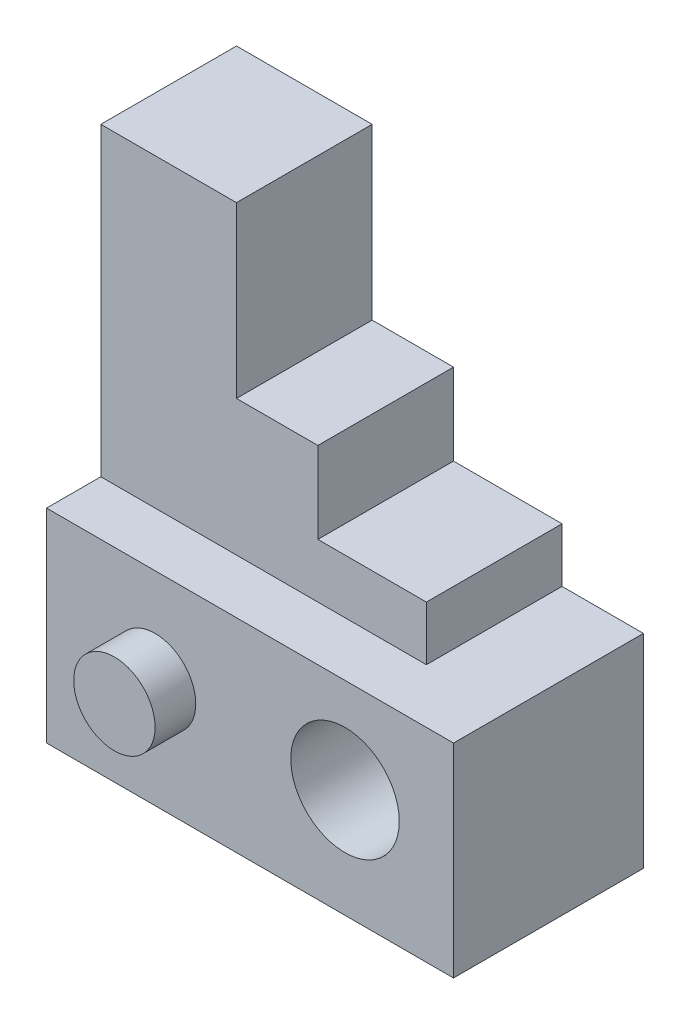
ISO-10303-21;
HEADER;
FILE_DESCRIPTION(('STEP AP214'),'2;1');
FILE_NAME('part.step','',(''),(''),'','','');
FILE_SCHEMA(('AUTOMOTIVE_DESIGN { 1 0 10303 214 1 1 1 1 }'));
ENDSEC;
DATA;
#1=APPLICATION_CONTEXT('core data for automotive mechanical design processes');
#2=APPLICATION_PROTOCOL_DEFINITION('international standard','automotive_design',2000,#1);
#3=PRODUCT_CONTEXT('',#1,'mechanical');
#4=PRODUCT('Part','Part','',(#3));
#5=PRODUCT_RELATED_PRODUCT_CATEGORY('part','',(#4));
#6=PRODUCT_DEFINITION_FORMATION('','',#4);
#7=PRODUCT_DEFINITION_CONTEXT('part definition',#1,'design');
#8=PRODUCT_DEFINITION('design','',#6,#7);
#9=PRODUCT_DEFINITION_SHAPE('','',#8);
#10=(LENGTH_UNIT() NAMED_UNIT(*) SI_UNIT(.MILLI.,.METRE.));
#11=(NAMED_UNIT(*) PLANE_ANGLE_UNIT() SI_UNIT($,.RADIAN.));
#12=(NAMED_UNIT(*) SI_UNIT($,.STERADIAN.) SOLID_ANGLE_UNIT());
#13=UNCERTAINTY_MEASURE_WITH_UNIT(LENGTH_MEASURE(1.E-05),#10,'distance_accuracy_value','');
#14=(GEOMETRIC_REPRESENTATION_CONTEXT(3) GLOBAL_UNCERTAINTY_ASSIGNED_CONTEXT((#13)) GLOBAL_UNIT_ASSIGNED_CONTEXT((#10,
#11,#12)) REPRESENTATION_CONTEXT('',''));
#15=CARTESIAN_POINT('',(0.,0.,0.));
#16=DIRECTION('',(0.,0.,1.));
#17=DIRECTION('',(1.,0.,0.));
#18=AXIS2_PLACEMENT_3D('',#15,#16,#17);
#19=CARTESIAN_POINT('',(0.,30.,28.));
#20=DIRECTION('',(0.,-1.,0.));
#21=DIRECTION('',(0.,0.,-1.));
#22=AXIS2_PLACEMENT_3D('',#19,#20,#21);
#23=PLANE('',#22);
#24=DIRECTION('',(0.,0.,-1.));
#25=VECTOR('',#24,1.);
#26=CARTESIAN_POINT('',(48.,30.,20.));
#27=LINE('',#26,#25);
#28=CARTESIAN_POINT('',(48.,30.,20.));
#29=VERTEX_POINT('',#28);
#30=CARTESIAN_POINT('',(48.,30.,0.));
#31=VERTEX_POINT('',#30);
#32=EDGE_CURVE('E127',#29,#31,#27,.T.);
#33=ORIENTED_EDGE('',*,*,#32,.F.);
#34=DIRECTION('',(1.,0.,0.));
#35=VECTOR('',#34,1.);
#36=CARTESIAN_POINT('',(48.,30.,20.));
#37=LINE('',#36,#35);
#38=CARTESIAN_POINT('',(0.,30.,20.));
#39=VERTEX_POINT('',#38);
#40=EDGE_CURVE('E60',#39,#29,#37,.T.);
#41=ORIENTED_EDGE('',*,*,#40,.F.);
#42=DIRECTION('',(0.,0.,-1.));
#43=VECTOR('',#42,1.);
#44=CARTESIAN_POINT('',(0.,30.,28.));
#45=LINE('',#44,#43);
#46=CARTESIAN_POINT('',(0.,30.,28.));
#47=VERTEX_POINT('',#46);
#48=EDGE_CURVE('E230',#47,#39,#45,.T.);
#49=ORIENTED_EDGE('',*,*,#48,.F.);
#50=DIRECTION('',(-1.,0.,0.));
#51=VECTOR('',#50,1.);
#52=CARTESIAN_POINT('',(0.,30.,28.));
#53=LINE('',#52,#51);
#54=CARTESIAN_POINT('',(60.,30.,28.));
#55=VERTEX_POINT('',#54);
#56=EDGE_CURVE('E227',#55,#47,#53,.T.);
#57=ORIENTED_EDGE('',*,*,#56,.F.);
#58=DIRECTION('',(0.,0.,-1.));
#59=VECTOR('',#58,1.);
#60=CARTESIAN_POINT('',(60.,30.,28.));
#61=LINE('',#60,#59);
#62=CARTESIAN_POINT('',(60.,30.,0.));
#63=VERTEX_POINT('',#62);
#64=EDGE_CURVE('E244',#55,#63,#61,.T.);
#65=ORIENTED_EDGE('',*,*,#64,.T.);
#66=DIRECTION('',(-1.,0.,0.));
#67=VECTOR('',#66,1.);
#68=CARTESIAN_POINT('',(0.,30.,0.));
#69=LINE('',#68,#67);
#70=EDGE_CURVE('E66',#63,#31,#69,.T.);
#71=ORIENTED_EDGE('',*,*,#70,.T.);
#72=EDGE_LOOP('',(#33,#41,#49,#57,#65,#71));
#73=FACE_BOUND('',#72,.T.);
#74=ADVANCED_FACE('F43',(#73),#23,.F.);
#75=CARTESIAN_POINT('',(0.,0.,28.));
#76=DIRECTION('',(0.,0.,-1.));
#77=DIRECTION('',(-1.,0.,0.));
#78=AXIS2_PLACEMENT_3D('',#75,#76,#77);
#79=PLANE('',#78);
#80=CARTESIAN_POINT('',(16.,16.,28.));
#81=DIRECTION('',(0.,0.,1.));
#82=DIRECTION('',(1.,0.,0.));
#83=AXIS2_PLACEMENT_3D('',#80,#81,#82);
#84=CIRCLE('',#83,6.);
#85=CARTESIAN_POINT('',(22.,16.,28.));
#86=VERTEX_POINT('',#85);
#87=EDGE_CURVE('E11',#86,#86,#84,.T.);
#88=ORIENTED_EDGE('',*,*,#87,.F.);
#89=EDGE_LOOP('',(#88));
#90=FACE_BOUND('',#89,.T.);
#91=DIRECTION('',(0.,-1.,0.));
#92=VECTOR('',#91,1.);
#93=CARTESIAN_POINT('',(0.,0.,28.));
#94=LINE('',#93,#92);
#95=CARTESIAN_POINT('',(0.,0.,28.));
#96=VERTEX_POINT('',#95);
#97=EDGE_CURVE('E217',#47,#96,#94,.T.);
#98=ORIENTED_EDGE('',*,*,#97,.T.);
#99=DIRECTION('',(1.,0.,0.));
#100=VECTOR('',#99,1.);
#101=CARTESIAN_POINT('',(0.,0.,28.));
#102=LINE('',#101,#100);
#103=CARTESIAN_POINT('',(60.,0.,28.));
#104=VERTEX_POINT('',#103);
#105=EDGE_CURVE('E221',#96,#104,#102,.T.);
#106=ORIENTED_EDGE('',*,*,#105,.T.);
#107=DIRECTION('',(0.,1.,0.));
#108=VECTOR('',#107,1.);
#109=CARTESIAN_POINT('',(60.,0.,28.));
#110=LINE('',#109,#108);
#111=EDGE_CURVE('E224',#104,#55,#110,.T.);
#112=ORIENTED_EDGE('',*,*,#111,.T.);
#113=ORIENTED_EDGE('',*,*,#56,.T.);
#114=EDGE_LOOP('',(#98,#106,#112,#113));
#115=FACE_BOUND('',#114,.T.);
#116=CARTESIAN_POINT('',(44.,16.,28.));
#117=DIRECTION('',(0.,0.,1.));
#118=DIRECTION('',(1.,0.,0.));
#119=AXIS2_PLACEMENT_3D('',#116,#117,#118);
#120=CIRCLE('',#119,8.);
#121=CARTESIAN_POINT('',(52.,16.,28.));
#122=VERTEX_POINT('',#121);
#123=EDGE_CURVE('E209',#122,#122,#120,.T.);
#124=ORIENTED_EDGE('',*,*,#123,.F.);
#125=EDGE_LOOP('',(#124));
#126=FACE_BOUND('',#125,.T.);
#127=ADVANCED_FACE('F291',(#90,#115,#126),#79,.F.);
#128=CARTESIAN_POINT('',(0.,0.,0.));
#129=DIRECTION('',(0.,0.,-1.));
#130=DIRECTION('',(-1.,0.,0.));
#131=AXIS2_PLACEMENT_3D('',#128,#129,#130);
#132=PLANE('',#131);
#133=DIRECTION('',(0.,-1.,0.));
#134=VECTOR('',#133,1.);
#135=CARTESIAN_POINT('',(0.,0.,0.));
#136=LINE('',#135,#134);
#137=CARTESIAN_POINT('',(0.,75.,0.));
#138=VERTEX_POINT('',#137);
#139=CARTESIAN_POINT('',(0.,0.,0.));
#140=VERTEX_POINT('',#139);
#141=EDGE_CURVE('E213',#138,#140,#136,.T.);
#142=ORIENTED_EDGE('',*,*,#141,.F.);
#143=DIRECTION('',(-1.,0.,0.));
#144=VECTOR('',#143,1.);
#145=CARTESIAN_POINT('',(0.,75.,0.));
#146=LINE('',#145,#144);
#147=CARTESIAN_POINT('',(20.,75.,0.));
#148=VERTEX_POINT('',#147);
#149=EDGE_CURVE('E148',#148,#138,#146,.T.);
#150=ORIENTED_EDGE('',*,*,#149,.F.);
#151=DIRECTION('',(0.,1.,0.));
#152=VECTOR('',#151,1.);
#153=CARTESIAN_POINT('',(20.,75.,0.));
#154=LINE('',#153,#152);
#155=CARTESIAN_POINT('',(20.,50.,0.));
#156=VERTEX_POINT('',#155);
#157=EDGE_CURVE('E152',#156,#148,#154,.T.);
#158=ORIENTED_EDGE('',*,*,#157,.F.);
#159=DIRECTION('',(-1.,0.,0.));
#160=VECTOR('',#159,1.);
#161=CARTESIAN_POINT('',(20.,50.,0.));
#162=LINE('',#161,#160);
#163=CARTESIAN_POINT('',(32.,50.,0.));
#164=VERTEX_POINT('',#163);
#165=EDGE_CURVE('E183',#164,#156,#162,.T.);
#166=ORIENTED_EDGE('',*,*,#165,.F.);
#167=DIRECTION('',(0.,1.,0.));
#168=VECTOR('',#167,1.);
#169=CARTESIAN_POINT('',(32.,50.,0.));
#170=LINE('',#169,#168);
#171=CARTESIAN_POINT('',(32.,38.,0.));
#172=VERTEX_POINT('',#171);
#173=EDGE_CURVE('E180',#172,#164,#170,.T.);
#174=ORIENTED_EDGE('',*,*,#173,.F.);
#175=DIRECTION('',(-1.,0.,0.));
#176=VECTOR('',#175,1.);
#177=CARTESIAN_POINT('',(32.,38.,0.));
#178=LINE('',#177,#176);
#179=CARTESIAN_POINT('',(48.,38.,0.));
#180=VERTEX_POINT('',#179);
#181=EDGE_CURVE('E176',#180,#172,#178,.T.);
#182=ORIENTED_EDGE('',*,*,#181,.F.);
#183=DIRECTION('',(0.,1.,0.));
#184=VECTOR('',#183,1.);
#185=CARTESIAN_POINT('',(48.,38.,0.));
#186=LINE('',#185,#184);
#187=EDGE_CURVE('E173',#31,#180,#186,.T.);
#188=ORIENTED_EDGE('',*,*,#187,.F.);
#189=ORIENTED_EDGE('',*,*,#70,.F.);
#190=DIRECTION('',(0.,1.,0.));
#191=VECTOR('',#190,1.);
#192=CARTESIAN_POINT('',(60.,0.,0.));
#193=LINE('',#192,#191);
#194=CARTESIAN_POINT('',(60.,0.,0.));
#195=VERTEX_POINT('',#194);
#196=EDGE_CURVE('E237',#195,#63,#193,.T.);
#197=ORIENTED_EDGE('',*,*,#196,.F.);
#198=DIRECTION('',(1.,0.,0.));
#199=VECTOR('',#198,1.);
#200=CARTESIAN_POINT('',(0.,0.,0.));
#201=LINE('',#200,#199);
#202=EDGE_CURVE('E234',#140,#195,#201,.T.);
#203=ORIENTED_EDGE('',*,*,#202,.F.);
#204=EDGE_LOOP('',(#142,#150,#158,#166,#174,#182,#188,#189,#197,#203));
#205=FACE_BOUND('',#204,.T.);
#206=CARTESIAN_POINT('',(44.,16.,0.));
#207=DIRECTION('',(0.,0.,1.));
#208=DIRECTION('',(1.,0.,0.));
#209=AXIS2_PLACEMENT_3D('',#206,#207,#208);
#210=CIRCLE('',#209,8.);
#211=CARTESIAN_POINT('',(52.,16.,0.));
#212=VERTEX_POINT('',#211);
#213=EDGE_CURVE('E131',#212,#212,#210,.T.);
#214=ORIENTED_EDGE('',*,*,#213,.T.);
#215=EDGE_LOOP('',(#214));
#216=FACE_BOUND('',#215,.T.);
#217=ADVANCED_FACE('F263',(#205,#216),#132,.T.);
#218=CARTESIAN_POINT('',(0.,0.,28.));
#219=DIRECTION('',(1.,0.,0.));
#220=DIRECTION('',(0.,0.,-1.));
#221=AXIS2_PLACEMENT_3D('',#218,#219,#220);
#222=PLANE('',#221);
#223=ORIENTED_EDGE('',*,*,#141,.T.);
#224=DIRECTION('',(0.,0.,-1.));
#225=VECTOR('',#224,1.);
#226=CARTESIAN_POINT('',(0.,0.,28.));
#227=LINE('',#226,#225);
#228=EDGE_CURVE('E47',#96,#140,#227,.T.);
#229=ORIENTED_EDGE('',*,*,#228,.F.);
#230=ORIENTED_EDGE('',*,*,#97,.F.);
#231=ORIENTED_EDGE('',*,*,#48,.T.);
#232=DIRECTION('',(0.,-1.,0.));
#233=VECTOR('',#232,1.);
#234=CARTESIAN_POINT('',(0.,30.,20.));
#235=LINE('',#234,#233);
#236=CARTESIAN_POINT('',(0.,75.,20.));
#237=VERTEX_POINT('',#236);
#238=EDGE_CURVE('E146',#237,#39,#235,.T.);
#239=ORIENTED_EDGE('',*,*,#238,.F.);
#240=DIRECTION('',(0.,0.,-1.));
#241=VECTOR('',#240,1.);
#242=CARTESIAN_POINT('',(0.,75.,20.));
#243=LINE('',#242,#241);
#244=EDGE_CURVE('E172',#237,#138,#243,.T.);
#245=ORIENTED_EDGE('',*,*,#244,.T.);
#246=EDGE_LOOP('',(#223,#229,#230,#231,#239,#245));
#247=FACE_BOUND('',#246,.T.);
#248=ADVANCED_FACE('F45',(#247),#222,.F.);
#249=CARTESIAN_POINT('',(0.,0.,28.));
#250=DIRECTION('',(0.,1.,0.));
#251=DIRECTION('',(0.,0.,1.));
#252=AXIS2_PLACEMENT_3D('',#249,#250,#251);
#253=PLANE('',#252);
#254=ORIENTED_EDGE('',*,*,#202,.T.);
#255=DIRECTION('',(0.,0.,-1.));
#256=VECTOR('',#255,1.);
#257=CARTESIAN_POINT('',(60.,0.,28.));
#258=LINE('',#257,#256);
#259=EDGE_CURVE('E246',#104,#195,#258,.T.);
#260=ORIENTED_EDGE('',*,*,#259,.F.);
#261=ORIENTED_EDGE('',*,*,#105,.F.);
#262=ORIENTED_EDGE('',*,*,#228,.T.);
#263=EDGE_LOOP('',(#254,#260,#261,#262));
#264=FACE_BOUND('',#263,.T.);
#265=ADVANCED_FACE('F257',(#264),#253,.F.);
#266=CARTESIAN_POINT('',(60.,0.,28.));
#267=DIRECTION('',(-1.,0.,0.));
#268=DIRECTION('',(0.,0.,1.));
#269=AXIS2_PLACEMENT_3D('',#266,#267,#268);
#270=PLANE('',#269);
#271=ORIENTED_EDGE('',*,*,#196,.T.);
#272=ORIENTED_EDGE('',*,*,#64,.F.);
#273=ORIENTED_EDGE('',*,*,#111,.F.);
#274=ORIENTED_EDGE('',*,*,#259,.T.);
#275=EDGE_LOOP('',(#271,#272,#273,#274));
#276=FACE_BOUND('',#275,.T.);
#277=ADVANCED_FACE('F288',(#276),#270,.F.);
#278=CARTESIAN_POINT('',(44.,16.,28.));
#279=DIRECTION('',(0.,0.,-1.));
#280=DIRECTION('',(-1.,0.,0.));
#281=AXIS2_PLACEMENT_3D('',#278,#279,#280);
#282=CYLINDRICAL_SURFACE('',#281,8.);
#283=ORIENTED_EDGE('',*,*,#123,.T.);
#284=EDGE_LOOP('',(#283));
#285=FACE_BOUND('',#284,.T.);
#286=ORIENTED_EDGE('',*,*,#213,.F.);
#287=EDGE_LOOP('',(#286));
#288=FACE_BOUND('',#287,.T.);
#289=ADVANCED_FACE('F298',(#285,#288),#282,.F.);
#290=CARTESIAN_POINT('',(48.,38.,20.));
#291=DIRECTION('',(-1.,0.,0.));
#292=DIRECTION('',(0.,0.,1.));
#293=AXIS2_PLACEMENT_3D('',#290,#291,#292);
#294=PLANE('',#293);
#295=ORIENTED_EDGE('',*,*,#187,.T.);
#296=DIRECTION('',(0.,0.,-1.));
#297=VECTOR('',#296,1.);
#298=CARTESIAN_POINT('',(48.,38.,20.));
#299=LINE('',#298,#297);
#300=CARTESIAN_POINT('',(48.,38.,20.));
#301=VERTEX_POINT('',#300);
#302=EDGE_CURVE('E132',#301,#180,#299,.T.);
#303=ORIENTED_EDGE('',*,*,#302,.F.);
#304=DIRECTION('',(0.,1.,0.));
#305=VECTOR('',#304,1.);
#306=CARTESIAN_POINT('',(48.,38.,20.));
#307=LINE('',#306,#305);
#308=EDGE_CURVE('E135',#29,#301,#307,.T.);
#309=ORIENTED_EDGE('',*,*,#308,.F.);
#310=ORIENTED_EDGE('',*,*,#32,.T.);
#311=EDGE_LOOP('',(#295,#303,#309,#310));
#312=FACE_BOUND('',#311,.T.);
#313=ADVANCED_FACE('F136',(#312),#294,.F.);
#314=CARTESIAN_POINT('',(32.,38.,20.));
#315=DIRECTION('',(0.,-1.,0.));
#316=DIRECTION('',(0.,0.,-1.));
#317=AXIS2_PLACEMENT_3D('',#314,#315,#316);
#318=PLANE('',#317);
#319=ORIENTED_EDGE('',*,*,#181,.T.);
#320=DIRECTION('',(0.,0.,-1.));
#321=VECTOR('',#320,1.);
#322=CARTESIAN_POINT('',(32.,38.,20.));
#323=LINE('',#322,#321);
#324=CARTESIAN_POINT('',(32.,38.,20.));
#325=VERTEX_POINT('',#324);
#326=EDGE_CURVE('E203',#325,#172,#323,.T.);
#327=ORIENTED_EDGE('',*,*,#326,.F.);
#328=DIRECTION('',(-1.,0.,0.));
#329=VECTOR('',#328,1.);
#330=CARTESIAN_POINT('',(32.,38.,20.));
#331=LINE('',#330,#329);
#332=EDGE_CURVE('E141',#301,#325,#331,.T.);
#333=ORIENTED_EDGE('',*,*,#332,.F.);
#334=ORIENTED_EDGE('',*,*,#302,.T.);
#335=EDGE_LOOP('',(#319,#327,#333,#334));
#336=FACE_BOUND('',#335,.T.);
#337=ADVANCED_FACE('F286',(#336),#318,.F.);
#338=CARTESIAN_POINT('',(32.,50.,20.));
#339=DIRECTION('',(-1.,0.,0.));
#340=DIRECTION('',(0.,-1.,0.));
#341=AXIS2_PLACEMENT_3D('',#338,#339,#340);
#342=PLANE('',#341);
#343=ORIENTED_EDGE('',*,*,#173,.T.);
#344=DIRECTION('',(0.,0.,-1.));
#345=VECTOR('',#344,1.);
#346=CARTESIAN_POINT('',(32.,50.,20.));
#347=LINE('',#346,#345);
#348=CARTESIAN_POINT('',(32.,50.,20.));
#349=VERTEX_POINT('',#348);
#350=EDGE_CURVE('E199',#349,#164,#347,.T.);
#351=ORIENTED_EDGE('',*,*,#350,.F.);
#352=DIRECTION('',(0.,1.,0.));
#353=VECTOR('',#352,1.);
#354=CARTESIAN_POINT('',(32.,50.,20.));
#355=LINE('',#354,#353);
#356=EDGE_CURVE('E158',#325,#349,#355,.T.);
#357=ORIENTED_EDGE('',*,*,#356,.F.);
#358=ORIENTED_EDGE('',*,*,#326,.T.);
#359=EDGE_LOOP('',(#343,#351,#357,#358));
#360=FACE_BOUND('',#359,.T.);
#361=ADVANCED_FACE('F283',(#360),#342,.F.);
#362=CARTESIAN_POINT('',(20.,50.,20.));
#363=DIRECTION('',(0.,-1.,0.));
#364=DIRECTION('',(1.,0.,0.));
#365=AXIS2_PLACEMENT_3D('',#362,#363,#364);
#366=PLANE('',#365);
#367=ORIENTED_EDGE('',*,*,#165,.T.);
#368=DIRECTION('',(0.,0.,-1.));
#369=VECTOR('',#368,1.);
#370=CARTESIAN_POINT('',(20.,50.,20.));
#371=LINE('',#370,#369);
#372=CARTESIAN_POINT('',(20.,50.,20.));
#373=VERTEX_POINT('',#372);
#374=EDGE_CURVE('E195',#373,#156,#371,.T.);
#375=ORIENTED_EDGE('',*,*,#374,.F.);
#376=DIRECTION('',(-1.,0.,0.));
#377=VECTOR('',#376,1.);
#378=CARTESIAN_POINT('',(20.,50.,20.));
#379=LINE('',#378,#377);
#380=EDGE_CURVE('E161',#349,#373,#379,.T.);
#381=ORIENTED_EDGE('',*,*,#380,.F.);
#382=ORIENTED_EDGE('',*,*,#350,.T.);
#383=EDGE_LOOP('',(#367,#375,#381,#382));
#384=FACE_BOUND('',#383,.T.);
#385=ADVANCED_FACE('F278',(#384),#366,.F.);
#386=CARTESIAN_POINT('',(20.,75.,20.));
#387=DIRECTION('',(-1.,0.,0.));
#388=DIRECTION('',(0.,-1.,0.));
#389=AXIS2_PLACEMENT_3D('',#386,#387,#388);
#390=PLANE('',#389);
#391=ORIENTED_EDGE('',*,*,#157,.T.);
#392=DIRECTION('',(0.,0.,-1.));
#393=VECTOR('',#392,1.);
#394=CARTESIAN_POINT('',(20.,75.,20.));
#395=LINE('',#394,#393);
#396=CARTESIAN_POINT('',(20.,75.,20.));
#397=VERTEX_POINT('',#396);
#398=EDGE_CURVE('E191',#397,#148,#395,.T.);
#399=ORIENTED_EDGE('',*,*,#398,.F.);
#400=DIRECTION('',(0.,1.,0.));
#401=VECTOR('',#400,1.);
#402=CARTESIAN_POINT('',(20.,75.,20.));
#403=LINE('',#402,#401);
#404=EDGE_CURVE('E164',#373,#397,#403,.T.);
#405=ORIENTED_EDGE('',*,*,#404,.F.);
#406=ORIENTED_EDGE('',*,*,#374,.T.);
#407=EDGE_LOOP('',(#391,#399,#405,#406));
#408=FACE_BOUND('',#407,.T.);
#409=ADVANCED_FACE('F272',(#408),#390,.F.);
#410=CARTESIAN_POINT('',(0.,75.,20.));
#411=DIRECTION('',(0.,-1.,0.));
#412=DIRECTION('',(0.,0.,-1.));
#413=AXIS2_PLACEMENT_3D('',#410,#411,#412);
#414=PLANE('',#413);
#415=ORIENTED_EDGE('',*,*,#149,.T.);
#416=ORIENTED_EDGE('',*,*,#244,.F.);
#417=DIRECTION('',(-1.,0.,0.));
#418=VECTOR('',#417,1.);
#419=CARTESIAN_POINT('',(0.,75.,20.));
#420=LINE('',#419,#418);
#421=EDGE_CURVE('E167',#397,#237,#420,.T.);
#422=ORIENTED_EDGE('',*,*,#421,.F.);
#423=ORIENTED_EDGE('',*,*,#398,.T.);
#424=EDGE_LOOP('',(#415,#416,#422,#423));
#425=FACE_BOUND('',#424,.T.);
#426=ADVANCED_FACE('F267',(#425),#414,.F.);
#427=CARTESIAN_POINT('',(0.,0.,20.));
#428=DIRECTION('',(0.,0.,-1.));
#429=DIRECTION('',(-1.,0.,0.));
#430=AXIS2_PLACEMENT_3D('',#427,#428,#429);
#431=PLANE('',#430);
#432=ORIENTED_EDGE('',*,*,#40,.T.);
#433=ORIENTED_EDGE('',*,*,#308,.T.);
#434=ORIENTED_EDGE('',*,*,#332,.T.);
#435=ORIENTED_EDGE('',*,*,#356,.T.);
#436=ORIENTED_EDGE('',*,*,#380,.T.);
#437=ORIENTED_EDGE('',*,*,#404,.T.);
#438=ORIENTED_EDGE('',*,*,#421,.T.);
#439=ORIENTED_EDGE('',*,*,#238,.T.);
#440=EDGE_LOOP('',(#432,#433,#434,#435,#436,#437,#438,#439));
#441=FACE_BOUND('',#440,.T.);
#442=ADVANCED_FACE('F144',(#441),#431,.F.);
#443=CARTESIAN_POINT('',(16.,16.,34.));
#444=DIRECTION('',(0.,0.,-1.));
#445=DIRECTION('',(-1.,0.,0.));
#446=AXIS2_PLACEMENT_3D('',#443,#444,#445);
#447=CYLINDRICAL_SURFACE('',#446,6.);
#448=CARTESIAN_POINT('',(16.,16.,34.));
#449=DIRECTION('',(0.,0.,1.));
#450=DIRECTION('',(1.,0.,0.));
#451=AXIS2_PLACEMENT_3D('',#448,#449,#450);
#452=CIRCLE('',#451,6.);
#453=CARTESIAN_POINT('',(22.,16.,34.));
#454=VERTEX_POINT('',#453);
#455=EDGE_CURVE('E177',#454,#454,#452,.T.);
#456=ORIENTED_EDGE('',*,*,#455,.F.);
#457=EDGE_LOOP('',(#456));
#458=FACE_BOUND('',#457,.T.);
#459=ORIENTED_EDGE('',*,*,#87,.T.);
#460=EDGE_LOOP('',(#459));
#461=FACE_BOUND('',#460,.T.);
#462=ADVANCED_FACE('F370',(#458,#461),#447,.T.);
#463=CARTESIAN_POINT('',(16.,16.,34.));
#464=DIRECTION('',(0.,0.,1.));
#465=DIRECTION('',(1.,0.,0.));
#466=AXIS2_PLACEMENT_3D('',#463,#464,#465);
#467=PLANE('',#466);
#468=ORIENTED_EDGE('',*,*,#455,.T.);
#469=EDGE_LOOP('',(#468));
#470=FACE_BOUND('',#469,.T.);
#471=ADVANCED_FACE('F377',(#470),#467,.T.);
#472=CLOSED_SHELL('',(#74,#127,#217,#248,#265,#277,#289,#313,#337,#361,#385,#409,#426,#442,#462,#471));
#473=MANIFOLD_SOLID_BREP('B2',#472);
#474=ADVANCED_BREP_SHAPE_REPRESENTATION('',(#18,#473),#14);
#475=SHAPE_DEFINITION_REPRESENTATION(#9,#474);
ENDSEC;
END-ISO-10303-21;
